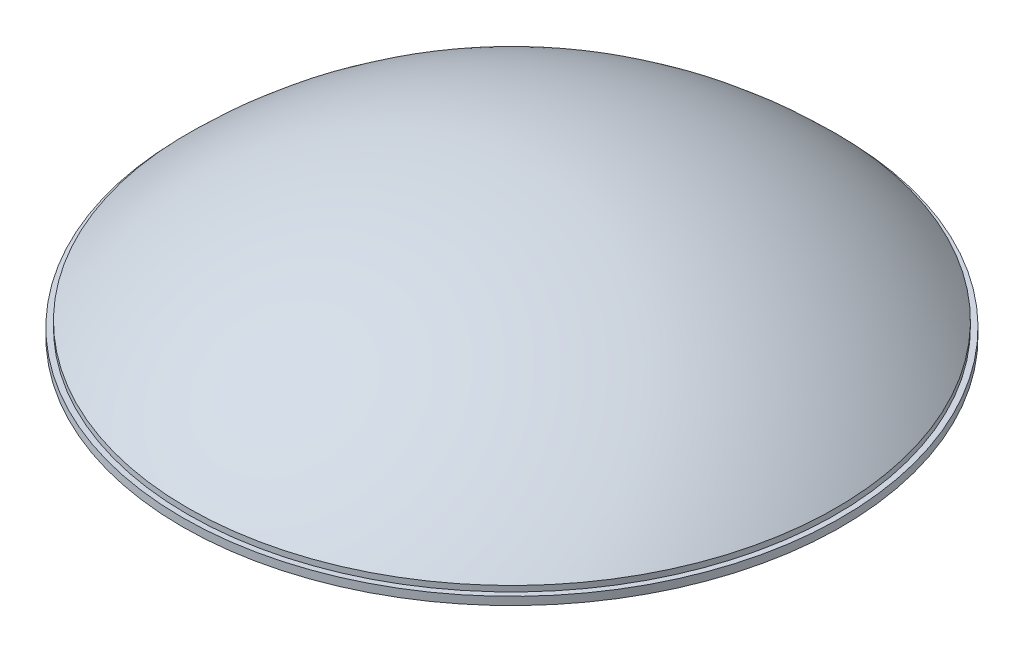
ISO-10303-21;
HEADER;
FILE_DESCRIPTION(('STEP AP214'),'2;1');
FILE_NAME('part.step','',(''),(''),'','','');
FILE_SCHEMA(('AUTOMOTIVE_DESIGN { 1 0 10303 214 1 1 1 1 }'));
ENDSEC;
DATA;
#1=APPLICATION_CONTEXT('core data for automotive mechanical design processes');
#2=APPLICATION_PROTOCOL_DEFINITION('international standard','automotive_design',2000,#1);
#3=PRODUCT_CONTEXT('',#1,'mechanical');
#4=PRODUCT('Part','Part','',(#3));
#5=PRODUCT_RELATED_PRODUCT_CATEGORY('part','',(#4));
#6=PRODUCT_DEFINITION_FORMATION('','',#4);
#7=PRODUCT_DEFINITION_CONTEXT('part definition',#1,'design');
#8=PRODUCT_DEFINITION('design','',#6,#7);
#9=PRODUCT_DEFINITION_SHAPE('','',#8);
#10=(LENGTH_UNIT() NAMED_UNIT(*) SI_UNIT(.MILLI.,.METRE.));
#11=(NAMED_UNIT(*) PLANE_ANGLE_UNIT() SI_UNIT($,.RADIAN.));
#12=(NAMED_UNIT(*) SI_UNIT($,.STERADIAN.) SOLID_ANGLE_UNIT());
#13=UNCERTAINTY_MEASURE_WITH_UNIT(LENGTH_MEASURE(1.E-05),#10,'distance_accuracy_value','');
#14=(GEOMETRIC_REPRESENTATION_CONTEXT(3) GLOBAL_UNCERTAINTY_ASSIGNED_CONTEXT((#13)) GLOBAL_UNIT_ASSIGNED_CONTEXT((#10,
#11,#12)) REPRESENTATION_CONTEXT('',''));
#15=CARTESIAN_POINT('',(0.,0.,0.));
#16=DIRECTION('',(0.,0.,1.));
#17=DIRECTION('',(1.,0.,0.));
#18=AXIS2_PLACEMENT_3D('',#15,#16,#17);
#19=CARTESIAN_POINT('',(0.,342.,0.));
#20=DIRECTION('',(0.,1.,0.));
#21=DIRECTION('',(0.,0.,1.));
#22=AXIS2_PLACEMENT_3D('',#19,#20,#21);
#23=CYLINDRICAL_SURFACE('',#22,246.5);
#24=CARTESIAN_POINT('',(0.,236.958329574839,0.));
#25=DIRECTION('',(0.,1.,0.));
#26=DIRECTION('',(0.,0.,1.));
#27=AXIS2_PLACEMENT_3D('',#24,#25,#26);
#28=CIRCLE('',#27,246.5);
#29=CARTESIAN_POINT('',(0.,236.958329574839,246.5));
#30=VERTEX_POINT('',#29);
#31=EDGE_CURVE('E10',#30,#30,#28,.T.);
#32=ORIENTED_EDGE('',*,*,#31,.F.);
#33=EDGE_LOOP('',(#32));
#34=FACE_BOUND('',#33,.T.);
#35=CARTESIAN_POINT('',(0.,230.958329574839,0.));
#36=DIRECTION('',(0.,1.,0.));
#37=DIRECTION('',(0.,0.,1.));
#38=AXIS2_PLACEMENT_3D('',#35,#36,#37);
#39=CIRCLE('',#38,246.5);
#40=CARTESIAN_POINT('',(0.,230.958329574839,246.5));
#41=VERTEX_POINT('',#40);
#42=EDGE_CURVE('E53',#41,#41,#39,.T.);
#43=ORIENTED_EDGE('',*,*,#42,.T.);
#44=EDGE_LOOP('',(#43));
#45=FACE_BOUND('',#44,.T.);
#46=ADVANCED_FACE('F34',(#34,#45),#23,.T.);
#47=CARTESIAN_POINT('',(0.,236.958329574839,-246.5));
#48=DIRECTION('',(0.,-1.,0.));
#49=DIRECTION('',(0.,0.,-1.));
#50=AXIS2_PLACEMENT_3D('',#47,#48,#49);
#51=PLANE('',#50);
#52=CARTESIAN_POINT('',(0.,236.958329574839,0.));
#53=DIRECTION('',(0.,1.,0.));
#54=DIRECTION('',(0.,0.,1.));
#55=AXIS2_PLACEMENT_3D('',#52,#53,#54);
#56=CIRCLE('',#55,242.5);
#57=CARTESIAN_POINT('',(0.,236.958329574839,242.5));
#58=VERTEX_POINT('',#57);
#59=EDGE_CURVE('E40',#58,#58,#56,.T.);
#60=ORIENTED_EDGE('',*,*,#59,.F.);
#61=EDGE_LOOP('',(#60));
#62=FACE_BOUND('',#61,.T.);
#63=ORIENTED_EDGE('',*,*,#31,.T.);
#64=EDGE_LOOP('',(#63));
#65=FACE_BOUND('',#64,.T.);
#66=ADVANCED_FACE('F75',(#62,#65),#51,.F.);
#67=CARTESIAN_POINT('',(0.,342.,0.));
#68=DIRECTION('',(0.,1.,0.));
#69=DIRECTION('',(0.,0.,1.));
#70=AXIS2_PLACEMENT_3D('',#67,#68,#69);
#71=CYLINDRICAL_SURFACE('',#70,242.5);
#72=CARTESIAN_POINT('',(0.,241.15917979625,0.));
#73=DIRECTION('',(0.,1.,0.));
#74=DIRECTION('',(0.,0.,1.));
#75=AXIS2_PLACEMENT_3D('',#72,#73,#74);
#76=CIRCLE('',#75,242.5);
#77=CARTESIAN_POINT('',(0.,241.15917979625,242.5));
#78=VERTEX_POINT('',#77);
#79=EDGE_CURVE('E44',#78,#78,#76,.T.);
#80=ORIENTED_EDGE('',*,*,#79,.F.);
#81=EDGE_LOOP('',(#80));
#82=FACE_BOUND('',#81,.T.);
#83=ORIENTED_EDGE('',*,*,#59,.T.);
#84=EDGE_LOOP('',(#83));
#85=FACE_BOUND('',#84,.T.);
#86=ADVANCED_FACE('F71',(#82,#85),#71,.T.);
#87=CARTESIAN_POINT('',(0.,0.,0.));
#88=DIRECTION('',(0.,1.,0.));
#89=DIRECTION('',(0.,0.,-1.));
#90=AXIS2_PLACEMENT_3D('',#87,#88,#89);
#91=SPHERICAL_SURFACE('',#90,342.);
#92=ORIENTED_EDGE('',*,*,#79,.T.);
#93=EDGE_LOOP('',(#92));
#94=FACE_BOUND('',#93,.T.);
#95=ADVANCED_FACE('F66',(#94),#91,.T.);
#96=CARTESIAN_POINT('',(0.,0.,0.));
#97=DIRECTION('',(0.,1.,0.));
#98=DIRECTION('',(0.,0.,1.));
#99=AXIS2_PLACEMENT_3D('',#96,#97,#98);
#100=SPHERICAL_SURFACE('',#99,332.);
#101=CARTESIAN_POINT('',(0.,230.958329574839,0.));
#102=DIRECTION('',(0.,1.,0.));
#103=DIRECTION('',(0.,0.,1.));
#104=AXIS2_PLACEMENT_3D('',#101,#102,#103);
#105=CIRCLE('',#104,238.5);
#106=CARTESIAN_POINT('',(0.,230.958329574839,238.5));
#107=VERTEX_POINT('',#106);
#108=EDGE_CURVE('E48',#107,#107,#105,.T.);
#109=ORIENTED_EDGE('',*,*,#108,.F.);
#110=EDGE_LOOP('',(#109));
#111=FACE_BOUND('',#110,.T.);
#112=ADVANCED_FACE('F61',(#111),#100,.F.);
#113=CARTESIAN_POINT('',(0.,230.958329574839,-246.5));
#114=DIRECTION('',(0.,1.,0.));
#115=DIRECTION('',(0.,0.,1.));
#116=AXIS2_PLACEMENT_3D('',#113,#114,#115);
#117=PLANE('',#116);
#118=ORIENTED_EDGE('',*,*,#42,.F.);
#119=EDGE_LOOP('',(#118));
#120=FACE_BOUND('',#119,.T.);
#121=ORIENTED_EDGE('',*,*,#108,.T.);
#122=EDGE_LOOP('',(#121));
#123=FACE_BOUND('',#122,.T.);
#124=ADVANCED_FACE('F58',(#120,#123),#117,.F.);
#125=CLOSED_SHELL('',(#46,#66,#86,#95,#112,#124));
#126=MANIFOLD_SOLID_BREP('B2',#125);
#127=ADVANCED_BREP_SHAPE_REPRESENTATION('',(#18,#126),#14);
#128=SHAPE_DEFINITION_REPRESENTATION(#9,#127);
ENDSEC;
END-ISO-10303-21;
